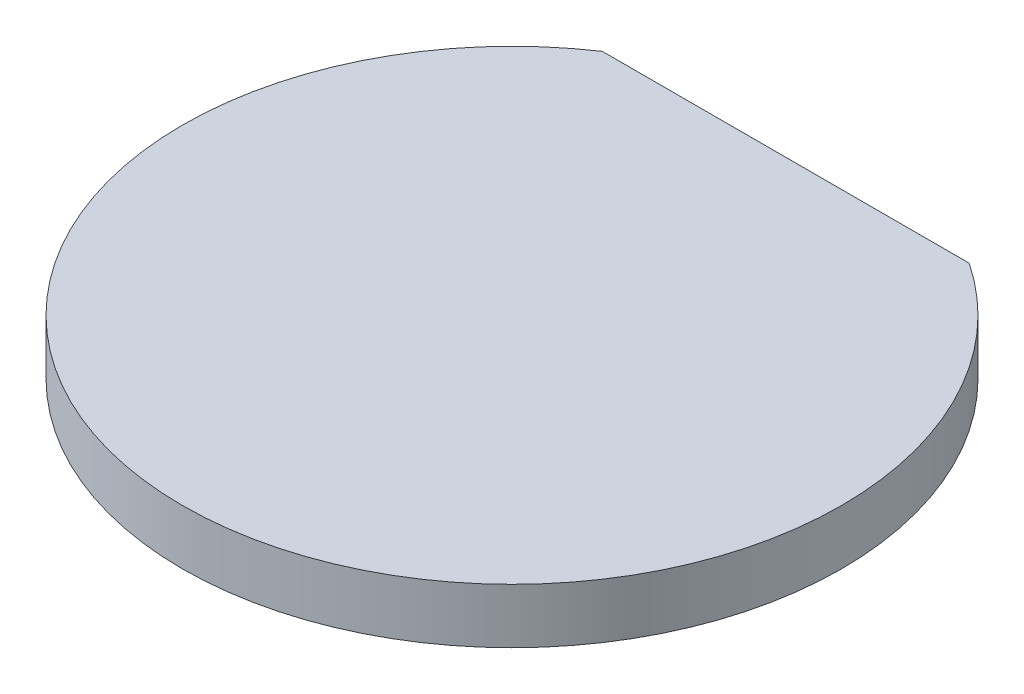
ISO-10303-21;
HEADER;
FILE_DESCRIPTION(('STEP AP214'),'2;1');
FILE_NAME('part.step','',(''),(''),'','','');
FILE_SCHEMA(('AUTOMOTIVE_DESIGN { 1 0 10303 214 1 1 1 1 }'));
ENDSEC;
DATA;
#1=APPLICATION_CONTEXT('core data for automotive mechanical design processes');
#2=APPLICATION_PROTOCOL_DEFINITION('international standard','automotive_design',2000,#1);
#3=PRODUCT_CONTEXT('',#1,'mechanical');
#4=PRODUCT('Part','Part','',(#3));
#5=PRODUCT_RELATED_PRODUCT_CATEGORY('part','',(#4));
#6=PRODUCT_DEFINITION_FORMATION('','',#4);
#7=PRODUCT_DEFINITION_CONTEXT('part definition',#1,'design');
#8=PRODUCT_DEFINITION('design','',#6,#7);
#9=PRODUCT_DEFINITION_SHAPE('','',#8);
#10=(LENGTH_UNIT() NAMED_UNIT(*) SI_UNIT(.MILLI.,.METRE.));
#11=(NAMED_UNIT(*) PLANE_ANGLE_UNIT() SI_UNIT($,.RADIAN.));
#12=(NAMED_UNIT(*) SI_UNIT($,.STERADIAN.) SOLID_ANGLE_UNIT());
#13=UNCERTAINTY_MEASURE_WITH_UNIT(LENGTH_MEASURE(1.E-05),#10,'distance_accuracy_value','');
#14=(GEOMETRIC_REPRESENTATION_CONTEXT(3) GLOBAL_UNCERTAINTY_ASSIGNED_CONTEXT((#13)) GLOBAL_UNIT_ASSIGNED_CONTEXT((#10,
#11,#12)) REPRESENTATION_CONTEXT('',''));
#15=CARTESIAN_POINT('',(0.,0.,0.));
#16=DIRECTION('',(0.,0.,1.));
#17=DIRECTION('',(1.,0.,0.));
#18=AXIS2_PLACEMENT_3D('',#15,#16,#17);
#19=CARTESIAN_POINT('',(0.,6.35,0.));
#20=DIRECTION('',(0.,-1.,0.));
#21=DIRECTION('',(0.,0.,-1.));
#22=AXIS2_PLACEMENT_3D('',#19,#20,#21);
#23=CYLINDRICAL_SURFACE('',#22,38.1);
#24=CARTESIAN_POINT('',(0.,6.35,0.));
#25=DIRECTION('',(0.,1.,0.));
#26=DIRECTION('',(0.,0.,1.));
#27=AXIS2_PLACEMENT_3D('',#24,#25,#26);
#28=CIRCLE('',#27,38.1);
#29=CARTESIAN_POINT('',(-21.209,6.35,-31.6510397775492));
#30=VERTEX_POINT('',#29);
#31=CARTESIAN_POINT('',(21.209,6.35,-31.6510397775492));
#32=VERTEX_POINT('',#31);
#33=EDGE_CURVE('E11',#30,#32,#28,.T.);
#34=ORIENTED_EDGE('',*,*,#33,.F.);
#35=DIRECTION('',(0.,1.,0.));
#36=VECTOR('',#35,1.);
#37=CARTESIAN_POINT('',(-21.209,0.,-31.6510397775492));
#38=LINE('',#37,#36);
#39=CARTESIAN_POINT('',(-21.209,0.,-31.6510397775492));
#40=VERTEX_POINT('',#39);
#41=EDGE_CURVE('E65',#40,#30,#38,.T.);
#42=ORIENTED_EDGE('',*,*,#41,.F.);
#43=CARTESIAN_POINT('',(0.,0.,0.));
#44=DIRECTION('',(0.,1.,0.));
#45=DIRECTION('',(0.,0.,1.));
#46=AXIS2_PLACEMENT_3D('',#43,#44,#45);
#47=CIRCLE('',#46,38.1);
#48=CARTESIAN_POINT('',(21.209,0.,-31.6510397775492));
#49=VERTEX_POINT('',#48);
#50=EDGE_CURVE('E50',#40,#49,#47,.T.);
#51=ORIENTED_EDGE('',*,*,#50,.T.);
#52=DIRECTION('',(0.,1.,0.));
#53=VECTOR('',#52,1.);
#54=CARTESIAN_POINT('',(21.209,0.,-31.6510397775492));
#55=LINE('',#54,#53);
#56=EDGE_CURVE('E58',#49,#32,#55,.T.);
#57=ORIENTED_EDGE('',*,*,#56,.T.);
#58=EDGE_LOOP('',(#34,#42,#51,#57));
#59=FACE_BOUND('',#58,.T.);
#60=ADVANCED_FACE('F41',(#59),#23,.T.);
#61=CARTESIAN_POINT('',(0.,6.35,0.));
#62=DIRECTION('',(0.,1.,0.));
#63=DIRECTION('',(0.,0.,1.));
#64=AXIS2_PLACEMENT_3D('',#61,#62,#63);
#65=PLANE('',#64);
#66=DIRECTION('',(1.,0.,0.));
#67=VECTOR('',#66,1.);
#68=CARTESIAN_POINT('',(-21.209,6.35,-31.6510397775492));
#69=LINE('',#68,#67);
#70=EDGE_CURVE('E44',#30,#32,#69,.T.);
#71=ORIENTED_EDGE('',*,*,#70,.F.);
#72=ORIENTED_EDGE('',*,*,#33,.T.);
#73=EDGE_LOOP('',(#71,#72));
#74=FACE_BOUND('',#73,.T.);
#75=ADVANCED_FACE('F79',(#74),#65,.T.);
#76=CARTESIAN_POINT('',(0.,0.,0.));
#77=DIRECTION('',(0.,1.,0.));
#78=DIRECTION('',(0.,0.,1.));
#79=AXIS2_PLACEMENT_3D('',#76,#77,#78);
#80=PLANE('',#79);
#81=ORIENTED_EDGE('',*,*,#50,.F.);
#82=DIRECTION('',(1.,0.,0.));
#83=VECTOR('',#82,1.);
#84=CARTESIAN_POINT('',(-21.209,0.,-31.6510397775492));
#85=LINE('',#84,#83);
#86=EDGE_CURVE('E67',#40,#49,#85,.T.);
#87=ORIENTED_EDGE('',*,*,#86,.T.);
#88=EDGE_LOOP('',(#81,#87));
#89=FACE_BOUND('',#88,.T.);
#90=ADVANCED_FACE('F76',(#89),#80,.F.);
#91=CARTESIAN_POINT('',(-21.209,0.,-31.6510397775492));
#92=DIRECTION('',(0.,0.,1.));
#93=DIRECTION('',(1.,0.,0.));
#94=AXIS2_PLACEMENT_3D('',#91,#92,#93);
#95=PLANE('',#94);
#96=ORIENTED_EDGE('',*,*,#70,.T.);
#97=ORIENTED_EDGE('',*,*,#56,.F.);
#98=ORIENTED_EDGE('',*,*,#86,.F.);
#99=ORIENTED_EDGE('',*,*,#41,.T.);
#100=EDGE_LOOP('',(#96,#97,#98,#99));
#101=FACE_BOUND('',#100,.T.);
#102=ADVANCED_FACE('F68',(#101),#95,.F.);
#103=CLOSED_SHELL('',(#60,#75,#90,#102));
#104=MANIFOLD_SOLID_BREP('B2',#103);
#105=ADVANCED_BREP_SHAPE_REPRESENTATION('',(#18,#104),#14);
#106=SHAPE_DEFINITION_REPRESENTATION(#9,#105);
ENDSEC;
END-ISO-10303-21;
